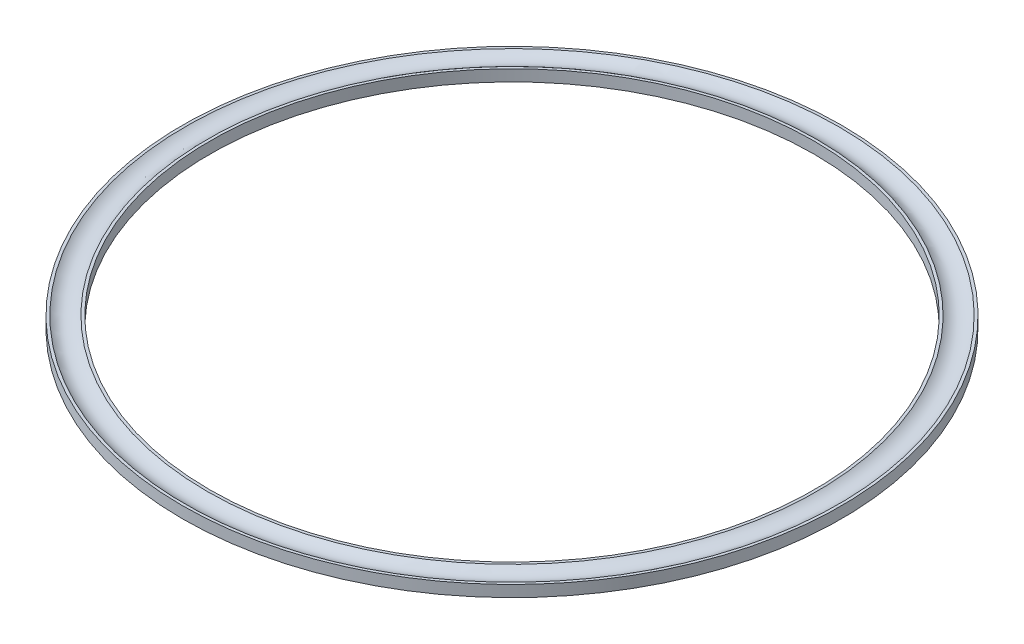
ISO-10303-21;
HEADER;
FILE_DESCRIPTION(('STEP AP214'),'2;1');
FILE_NAME('part.step','',(''),(''),'','','');
FILE_SCHEMA(('AUTOMOTIVE_DESIGN { 1 0 10303 214 1 1 1 1 }'));
ENDSEC;
DATA;
#1=APPLICATION_CONTEXT('core data for automotive mechanical design processes');
#2=APPLICATION_PROTOCOL_DEFINITION('international standard','automotive_design',2000,#1);
#3=PRODUCT_CONTEXT('',#1,'mechanical');
#4=PRODUCT('Part','Part','',(#3));
#5=PRODUCT_RELATED_PRODUCT_CATEGORY('part','',(#4));
#6=PRODUCT_DEFINITION_FORMATION('','',#4);
#7=PRODUCT_DEFINITION_CONTEXT('part definition',#1,'design');
#8=PRODUCT_DEFINITION('design','',#6,#7);
#9=PRODUCT_DEFINITION_SHAPE('','',#8);
#10=(LENGTH_UNIT() NAMED_UNIT(*) SI_UNIT(.MILLI.,.METRE.));
#11=(NAMED_UNIT(*) PLANE_ANGLE_UNIT() SI_UNIT($,.RADIAN.));
#12=(NAMED_UNIT(*) SI_UNIT($,.STERADIAN.) SOLID_ANGLE_UNIT());
#13=UNCERTAINTY_MEASURE_WITH_UNIT(LENGTH_MEASURE(1.E-05),#10,'distance_accuracy_value','');
#14=(GEOMETRIC_REPRESENTATION_CONTEXT(3) GLOBAL_UNCERTAINTY_ASSIGNED_CONTEXT((#13)) GLOBAL_UNIT_ASSIGNED_CONTEXT((#10,
#11,#12)) REPRESENTATION_CONTEXT('',''));
#15=CARTESIAN_POINT('',(0.,0.,0.));
#16=DIRECTION('',(0.,0.,1.));
#17=DIRECTION('',(1.,0.,0.));
#18=AXIS2_PLACEMENT_3D('',#15,#16,#17);
#19=CARTESIAN_POINT('',(55.8038,0.965199999999999,0.));
#20=DIRECTION('',(0.,1.,0.));
#21=DIRECTION('',(0.,0.,1.));
#22=AXIS2_PLACEMENT_3D('',#19,#20,#21);
#23=PLANE('',#22);
#24=CARTESIAN_POINT('',(0.,0.965199999999999,0.));
#25=DIRECTION('',(0.,-1.,0.));
#26=DIRECTION('',(0.,0.,-1.));
#27=AXIS2_PLACEMENT_3D('',#24,#25,#26);
#28=CIRCLE('',#27,55.33898);
#29=CARTESIAN_POINT('',(0.,0.965199999999999,-55.33898));
#30=VERTEX_POINT('',#29);
#31=EDGE_CURVE('E10',#30,#30,#28,.T.);
#32=ORIENTED_EDGE('',*,*,#31,.T.);
#33=EDGE_LOOP('',(#32));
#34=FACE_BOUND('',#33,.T.);
#35=CARTESIAN_POINT('',(0.,0.965199999999999,0.));
#36=DIRECTION('',(0.,-1.,0.));
#37=DIRECTION('',(0.,0.,-1.));
#38=AXIS2_PLACEMENT_3D('',#35,#36,#37);
#39=CIRCLE('',#38,55.8038);
#40=CARTESIAN_POINT('',(0.,0.965199999999999,-55.8038));
#41=VERTEX_POINT('',#40);
#42=EDGE_CURVE('E50',#41,#41,#39,.T.);
#43=ORIENTED_EDGE('',*,*,#42,.F.);
#44=EDGE_LOOP('',(#43));
#45=FACE_BOUND('',#44,.T.);
#46=ADVANCED_FACE('F28',(#34,#45),#23,.T.);
#47=CARTESIAN_POINT('',(0.,3.22977480916031,1.66533453693773E-13));
#48=DIRECTION('',(0.,-1.,0.));
#49=DIRECTION('',(0.,0.,-1.));
#50=AXIS2_PLACEMENT_3D('',#47,#48,#49);
#51=TOROIDAL_SURFACE('',#50,53.4797,2.93005480916032);
#52=CARTESIAN_POINT('',(0.,0.965199999999999,0.));
#53=DIRECTION('',(0.,-1.,0.));
#54=DIRECTION('',(0.,0.,-1.));
#55=AXIS2_PLACEMENT_3D('',#52,#53,#54);
#56=CIRCLE('',#55,51.62042);
#57=CARTESIAN_POINT('',(0.,0.965199999999999,-51.62042));
#58=VERTEX_POINT('',#57);
#59=EDGE_CURVE('E34',#58,#58,#56,.T.);
#60=ORIENTED_EDGE('',*,*,#59,.T.);
#61=EDGE_LOOP('',(#60));
#62=FACE_BOUND('',#61,.T.);
#63=ORIENTED_EDGE('',*,*,#31,.F.);
#64=EDGE_LOOP('',(#63));
#65=FACE_BOUND('',#64,.T.);
#66=ADVANCED_FACE('F58',(#62,#65),#51,.F.);
#67=CARTESIAN_POINT('',(51.1556,0.965200000000083,0.));
#68=DIRECTION('',(0.,1.,0.));
#69=DIRECTION('',(0.,0.,1.));
#70=AXIS2_PLACEMENT_3D('',#67,#68,#69);
#71=PLANE('',#70);
#72=CARTESIAN_POINT('',(0.,0.965199999999999,0.));
#73=DIRECTION('',(0.,-1.,0.));
#74=DIRECTION('',(0.,0.,-1.));
#75=AXIS2_PLACEMENT_3D('',#72,#73,#74);
#76=CIRCLE('',#75,51.1556);
#77=CARTESIAN_POINT('',(0.,0.965199999999999,-51.1556));
#78=VERTEX_POINT('',#77);
#79=EDGE_CURVE('E38',#78,#78,#76,.T.);
#80=ORIENTED_EDGE('',*,*,#79,.T.);
#81=EDGE_LOOP('',(#80));
#82=FACE_BOUND('',#81,.T.);
#83=ORIENTED_EDGE('',*,*,#59,.F.);
#84=EDGE_LOOP('',(#83));
#85=FACE_BOUND('',#84,.T.);
#86=ADVANCED_FACE('F62',(#82,#85),#71,.T.);
#87=CARTESIAN_POINT('',(0.,-11.4126253664222,0.));
#88=DIRECTION('',(0.,-1.,0.));
#89=DIRECTION('',(0.,0.,-1.));
#90=AXIS2_PLACEMENT_3D('',#87,#88,#89);
#91=CYLINDRICAL_SURFACE('',#90,51.1556);
#92=CARTESIAN_POINT('',(0.,-0.965199999999999,0.));
#93=DIRECTION('',(0.,-1.,0.));
#94=DIRECTION('',(0.,0.,-1.));
#95=AXIS2_PLACEMENT_3D('',#92,#93,#94);
#96=CIRCLE('',#95,51.1556);
#97=CARTESIAN_POINT('',(0.,-0.965199999999999,-51.1556));
#98=VERTEX_POINT('',#97);
#99=EDGE_CURVE('E42',#98,#98,#96,.T.);
#100=ORIENTED_EDGE('',*,*,#99,.T.);
#101=EDGE_LOOP('',(#100));
#102=FACE_BOUND('',#101,.T.);
#103=ORIENTED_EDGE('',*,*,#79,.F.);
#104=EDGE_LOOP('',(#103));
#105=FACE_BOUND('',#104,.T.);
#106=ADVANCED_FACE('F66',(#102,#105),#91,.F.);
#107=CARTESIAN_POINT('',(55.8038,-0.965199999999999,0.));
#108=DIRECTION('',(0.,-1.,0.));
#109=DIRECTION('',(0.,0.,-1.));
#110=AXIS2_PLACEMENT_3D('',#107,#108,#109);
#111=PLANE('',#110);
#112=CARTESIAN_POINT('',(0.,-0.965199999999999,0.));
#113=DIRECTION('',(0.,-1.,0.));
#114=DIRECTION('',(0.,0.,-1.));
#115=AXIS2_PLACEMENT_3D('',#112,#113,#114);
#116=CIRCLE('',#115,55.8038);
#117=CARTESIAN_POINT('',(0.,-0.965199999999999,-55.8038));
#118=VERTEX_POINT('',#117);
#119=EDGE_CURVE('E47',#118,#118,#116,.T.);
#120=ORIENTED_EDGE('',*,*,#119,.T.);
#121=EDGE_LOOP('',(#120));
#122=FACE_BOUND('',#121,.T.);
#123=ORIENTED_EDGE('',*,*,#99,.F.);
#124=EDGE_LOOP('',(#123));
#125=FACE_BOUND('',#124,.T.);
#126=ADVANCED_FACE('F73',(#122,#125),#111,.T.);
#127=CARTESIAN_POINT('',(0.,-11.4126253664222,0.));
#128=DIRECTION('',(0.,-1.,0.));
#129=DIRECTION('',(0.,0.,-1.));
#130=AXIS2_PLACEMENT_3D('',#127,#128,#129);
#131=CYLINDRICAL_SURFACE('',#130,55.8038);
#132=ORIENTED_EDGE('',*,*,#42,.T.);
#133=EDGE_LOOP('',(#132));
#134=FACE_BOUND('',#133,.T.);
#135=ORIENTED_EDGE('',*,*,#119,.F.);
#136=EDGE_LOOP('',(#135));
#137=FACE_BOUND('',#136,.T.);
#138=ADVANCED_FACE('F54',(#134,#137),#131,.T.);
#139=CLOSED_SHELL('',(#46,#66,#86,#106,#126,#138));
#140=MANIFOLD_SOLID_BREP('B2',#139);
#141=ADVANCED_BREP_SHAPE_REPRESENTATION('',(#18,#140),#14);
#142=SHAPE_DEFINITION_REPRESENTATION(#9,#141);
ENDSEC;
END-ISO-10303-21;
